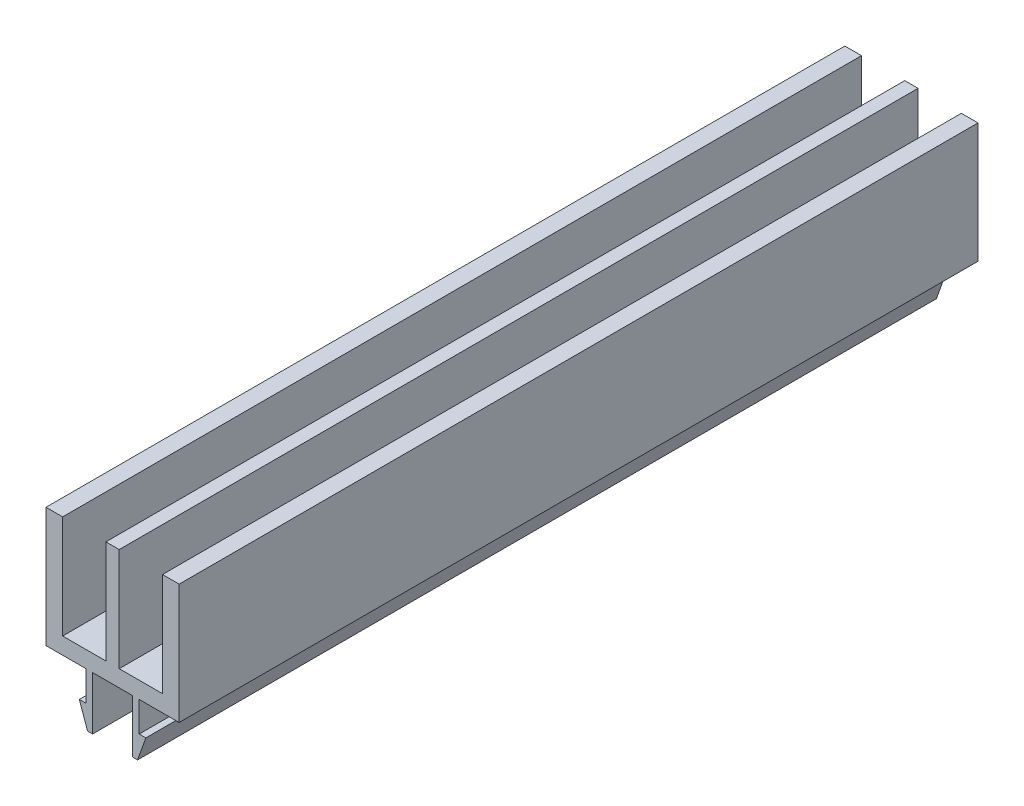
ISO-10303-21;
HEADER;
FILE_DESCRIPTION(('STEP AP214'),'2;1');
FILE_NAME('part.step','',(''),(''),'','','');
FILE_SCHEMA(('AUTOMOTIVE_DESIGN { 1 0 10303 214 1 1 1 1 }'));
ENDSEC;
DATA;
#1=APPLICATION_CONTEXT('core data for automotive mechanical design processes');
#2=APPLICATION_PROTOCOL_DEFINITION('international standard','automotive_design',2000,#1);
#3=PRODUCT_CONTEXT('',#1,'mechanical');
#4=PRODUCT('Part','Part','',(#3));
#5=PRODUCT_RELATED_PRODUCT_CATEGORY('part','',(#4));
#6=PRODUCT_DEFINITION_FORMATION('','',#4);
#7=PRODUCT_DEFINITION_CONTEXT('part definition',#1,'design');
#8=PRODUCT_DEFINITION('design','',#6,#7);
#9=PRODUCT_DEFINITION_SHAPE('','',#8);
#10=(LENGTH_UNIT() NAMED_UNIT(*) SI_UNIT(.MILLI.,.METRE.));
#11=(NAMED_UNIT(*) PLANE_ANGLE_UNIT() SI_UNIT($,.RADIAN.));
#12=(NAMED_UNIT(*) SI_UNIT($,.STERADIAN.) SOLID_ANGLE_UNIT());
#13=UNCERTAINTY_MEASURE_WITH_UNIT(LENGTH_MEASURE(1.E-05),#10,'distance_accuracy_value','');
#14=(GEOMETRIC_REPRESENTATION_CONTEXT(3) GLOBAL_UNCERTAINTY_ASSIGNED_CONTEXT((#13)) GLOBAL_UNIT_ASSIGNED_CONTEXT((#10,
#11,#12)) REPRESENTATION_CONTEXT('',''));
#15=CARTESIAN_POINT('',(0.,0.,0.));
#16=DIRECTION('',(0.,0.,1.));
#17=DIRECTION('',(1.,0.,0.));
#18=AXIS2_PLACEMENT_3D('',#15,#16,#17);
#19=CARTESIAN_POINT('',(-1.,17.9999999975,-70.));
#20=DIRECTION('',(-1.,0.,0.));
#21=DIRECTION('',(0.,-1.,0.));
#22=AXIS2_PLACEMENT_3D('',#19,#20,#21);
#23=PLANE('',#22);
#24=DIRECTION('',(0.,-1.,0.));
#25=VECTOR('',#24,1.);
#26=CARTESIAN_POINT('',(-1.,17.9999999975,50.));
#27=LINE('',#26,#25);
#28=CARTESIAN_POINT('',(-1.,17.9999999975,50.));
#29=VERTEX_POINT('',#28);
#30=CARTESIAN_POINT('',(-1.,2.4999999995,50.));
#31=VERTEX_POINT('',#30);
#32=EDGE_CURVE('E228',#29,#31,#27,.T.);
#33=ORIENTED_EDGE('',*,*,#32,.F.);
#34=DIRECTION('',(0.,0.,1.));
#35=VECTOR('',#34,1.);
#36=CARTESIAN_POINT('',(-1.,17.9999999975,-70.));
#37=LINE('',#36,#35);
#38=CARTESIAN_POINT('',(-1.,17.9999999975,-70.));
#39=VERTEX_POINT('',#38);
#40=EDGE_CURVE('E11',#39,#29,#37,.T.);
#41=ORIENTED_EDGE('',*,*,#40,.F.);
#42=DIRECTION('',(0.,-1.,0.));
#43=VECTOR('',#42,1.);
#44=CARTESIAN_POINT('',(-1.,17.9999999975,-70.));
#45=LINE('',#44,#43);
#46=CARTESIAN_POINT('',(-1.,2.4999999995,-70.));
#47=VERTEX_POINT('',#46);
#48=EDGE_CURVE('E296',#39,#47,#45,.T.);
#49=ORIENTED_EDGE('',*,*,#48,.T.);
#50=DIRECTION('',(0.,0.,1.));
#51=VECTOR('',#50,1.);
#52=CARTESIAN_POINT('',(-1.,2.4999999995,-70.));
#53=LINE('',#52,#51);
#54=EDGE_CURVE('E38',#47,#31,#53,.T.);
#55=ORIENTED_EDGE('',*,*,#54,.T.);
#56=EDGE_LOOP('',(#33,#41,#49,#55));
#57=FACE_BOUND('',#56,.T.);
#58=ADVANCED_FACE('F35',(#57),#23,.T.);
#59=CARTESIAN_POINT('',(0.999999999999998,17.9999999975,-70.));
#60=DIRECTION('',(0.,1.,0.));
#61=DIRECTION('',(0.,0.,1.));
#62=AXIS2_PLACEMENT_3D('',#59,#60,#61);
#63=PLANE('',#62);
#64=DIRECTION('',(-1.,0.,0.));
#65=VECTOR('',#64,1.);
#66=CARTESIAN_POINT('',(0.999999999999998,17.9999999975,50.));
#67=LINE('',#66,#65);
#68=CARTESIAN_POINT('',(0.999999999999998,17.9999999975,50.));
#69=VERTEX_POINT('',#68);
#70=EDGE_CURVE('E294',#69,#29,#67,.T.);
#71=ORIENTED_EDGE('',*,*,#70,.F.);
#72=DIRECTION('',(0.,0.,1.));
#73=VECTOR('',#72,1.);
#74=CARTESIAN_POINT('',(0.999999999999998,17.9999999975,-70.));
#75=LINE('',#74,#73);
#76=CARTESIAN_POINT('',(0.999999999999998,17.9999999975,-70.));
#77=VERTEX_POINT('',#76);
#78=EDGE_CURVE('E44',#77,#69,#75,.T.);
#79=ORIENTED_EDGE('',*,*,#78,.F.);
#80=DIRECTION('',(-1.,0.,0.));
#81=VECTOR('',#80,1.);
#82=CARTESIAN_POINT('',(0.999999999999998,17.9999999975,-70.));
#83=LINE('',#82,#81);
#84=EDGE_CURVE('E218',#77,#39,#83,.T.);
#85=ORIENTED_EDGE('',*,*,#84,.T.);
#86=ORIENTED_EDGE('',*,*,#40,.T.);
#87=EDGE_LOOP('',(#71,#79,#85,#86));
#88=FACE_BOUND('',#87,.T.);
#89=ADVANCED_FACE('F340',(#88),#63,.T.);
#90=CARTESIAN_POINT('',(0.999999999999998,2.4999999995,-70.));
#91=DIRECTION('',(1.,0.,0.));
#92=DIRECTION('',(0.,0.,-1.));
#93=AXIS2_PLACEMENT_3D('',#90,#91,#92);
#94=PLANE('',#93);
#95=DIRECTION('',(0.,1.,0.));
#96=VECTOR('',#95,1.);
#97=CARTESIAN_POINT('',(0.999999999999998,2.4999999995,50.));
#98=LINE('',#97,#96);
#99=CARTESIAN_POINT('',(0.999999999999998,2.4999999995,50.));
#100=VERTEX_POINT('',#99);
#101=EDGE_CURVE('E205',#100,#69,#98,.T.);
#102=ORIENTED_EDGE('',*,*,#101,.F.);
#103=DIRECTION('',(0.,0.,1.));
#104=VECTOR('',#103,1.);
#105=CARTESIAN_POINT('',(0.999999999999998,2.4999999995,-70.));
#106=LINE('',#105,#104);
#107=CARTESIAN_POINT('',(0.999999999999998,2.4999999995,-70.));
#108=VERTEX_POINT('',#107);
#109=EDGE_CURVE('E200',#108,#100,#106,.T.);
#110=ORIENTED_EDGE('',*,*,#109,.F.);
#111=DIRECTION('',(0.,1.,0.));
#112=VECTOR('',#111,1.);
#113=CARTESIAN_POINT('',(0.999999999999998,2.4999999995,-70.));
#114=LINE('',#113,#112);
#115=EDGE_CURVE('E203',#108,#77,#114,.T.);
#116=ORIENTED_EDGE('',*,*,#115,.T.);
#117=ORIENTED_EDGE('',*,*,#78,.T.);
#118=EDGE_LOOP('',(#102,#110,#116,#117));
#119=FACE_BOUND('',#118,.T.);
#120=ADVANCED_FACE('F202',(#119),#94,.T.);
#121=CARTESIAN_POINT('',(7.5,2.4999999995,-70.));
#122=DIRECTION('',(0.,1.,0.));
#123=DIRECTION('',(-1.,0.,0.));
#124=AXIS2_PLACEMENT_3D('',#121,#122,#123);
#125=PLANE('',#124);
#126=DIRECTION('',(-1.,0.,0.));
#127=VECTOR('',#126,1.);
#128=CARTESIAN_POINT('',(7.5,2.4999999995,50.));
#129=LINE('',#128,#127);
#130=CARTESIAN_POINT('',(7.5,2.4999999995,50.));
#131=VERTEX_POINT('',#130);
#132=EDGE_CURVE('E291',#131,#100,#129,.T.);
#133=ORIENTED_EDGE('',*,*,#132,.F.);
#134=DIRECTION('',(0.,0.,1.));
#135=VECTOR('',#134,1.);
#136=CARTESIAN_POINT('',(7.5,2.4999999995,-70.));
#137=LINE('',#136,#135);
#138=CARTESIAN_POINT('',(7.5,2.4999999995,-70.));
#139=VERTEX_POINT('',#138);
#140=EDGE_CURVE('E210',#139,#131,#137,.T.);
#141=ORIENTED_EDGE('',*,*,#140,.F.);
#142=DIRECTION('',(-1.,0.,0.));
#143=VECTOR('',#142,1.);
#144=CARTESIAN_POINT('',(7.5,2.4999999995,-70.));
#145=LINE('',#144,#143);
#146=EDGE_CURVE('E216',#139,#108,#145,.T.);
#147=ORIENTED_EDGE('',*,*,#146,.T.);
#148=ORIENTED_EDGE('',*,*,#109,.T.);
#149=EDGE_LOOP('',(#133,#141,#147,#148));
#150=FACE_BOUND('',#149,.T.);
#151=ADVANCED_FACE('F220',(#150),#125,.T.);
#152=CARTESIAN_POINT('',(7.5,17.9999999975,-70.));
#153=DIRECTION('',(-1.,0.,0.));
#154=DIRECTION('',(0.,-1.,0.));
#155=AXIS2_PLACEMENT_3D('',#152,#153,#154);
#156=PLANE('',#155);
#157=DIRECTION('',(0.,-1.,0.));
#158=VECTOR('',#157,1.);
#159=CARTESIAN_POINT('',(7.5,17.9999999975,50.));
#160=LINE('',#159,#158);
#161=CARTESIAN_POINT('',(7.5,17.9999999975,50.));
#162=VERTEX_POINT('',#161);
#163=EDGE_CURVE('E288',#162,#131,#160,.T.);
#164=ORIENTED_EDGE('',*,*,#163,.F.);
#165=DIRECTION('',(0.,0.,1.));
#166=VECTOR('',#165,1.);
#167=CARTESIAN_POINT('',(7.5,17.9999999975,-70.));
#168=LINE('',#167,#166);
#169=CARTESIAN_POINT('',(7.5,17.9999999975,-70.));
#170=VERTEX_POINT('',#169);
#171=EDGE_CURVE('E300',#170,#162,#168,.T.);
#172=ORIENTED_EDGE('',*,*,#171,.F.);
#173=DIRECTION('',(0.,-1.,0.));
#174=VECTOR('',#173,1.);
#175=CARTESIAN_POINT('',(7.5,17.9999999975,-70.));
#176=LINE('',#175,#174);
#177=EDGE_CURVE('E221',#170,#139,#176,.T.);
#178=ORIENTED_EDGE('',*,*,#177,.T.);
#179=ORIENTED_EDGE('',*,*,#140,.T.);
#180=EDGE_LOOP('',(#164,#172,#178,#179));
#181=FACE_BOUND('',#180,.T.);
#182=ADVANCED_FACE('F353',(#181),#156,.T.);
#183=CARTESIAN_POINT('',(10.,17.9999999975,-70.));
#184=DIRECTION('',(0.,1.,0.));
#185=DIRECTION('',(0.,0.,1.));
#186=AXIS2_PLACEMENT_3D('',#183,#184,#185);
#187=PLANE('',#186);
#188=DIRECTION('',(-1.,0.,0.));
#189=VECTOR('',#188,1.);
#190=CARTESIAN_POINT('',(10.,17.9999999975,50.));
#191=LINE('',#190,#189);
#192=CARTESIAN_POINT('',(10.,17.9999999975,50.));
#193=VERTEX_POINT('',#192);
#194=EDGE_CURVE('E285',#193,#162,#191,.T.);
#195=ORIENTED_EDGE('',*,*,#194,.F.);
#196=DIRECTION('',(0.,0.,1.));
#197=VECTOR('',#196,1.);
#198=CARTESIAN_POINT('',(10.,17.9999999975,-70.));
#199=LINE('',#198,#197);
#200=CARTESIAN_POINT('',(10.,17.9999999975,-70.));
#201=VERTEX_POINT('',#200);
#202=EDGE_CURVE('E302',#201,#193,#199,.T.);
#203=ORIENTED_EDGE('',*,*,#202,.F.);
#204=DIRECTION('',(-1.,0.,0.));
#205=VECTOR('',#204,1.);
#206=CARTESIAN_POINT('',(10.,17.9999999975,-70.));
#207=LINE('',#206,#205);
#208=EDGE_CURVE('E223',#201,#170,#207,.T.);
#209=ORIENTED_EDGE('',*,*,#208,.T.);
#210=ORIENTED_EDGE('',*,*,#171,.T.);
#211=EDGE_LOOP('',(#195,#203,#209,#210));
#212=FACE_BOUND('',#211,.T.);
#213=ADVANCED_FACE('F356',(#212),#187,.T.);
#214=CARTESIAN_POINT('',(10.,-4.99999828349541E-10,-70.));
#215=DIRECTION('',(1.,0.,0.));
#216=DIRECTION('',(0.,0.,-1.));
#217=AXIS2_PLACEMENT_3D('',#214,#215,#216);
#218=PLANE('',#217);
#219=DIRECTION('',(0.,1.,0.));
#220=VECTOR('',#219,1.);
#221=CARTESIAN_POINT('',(10.,-4.99999828349541E-10,50.));
#222=LINE('',#221,#220);
#223=CARTESIAN_POINT('',(10.,-4.99999828349541E-10,50.));
#224=VERTEX_POINT('',#223);
#225=EDGE_CURVE('E282',#224,#193,#222,.T.);
#226=ORIENTED_EDGE('',*,*,#225,.F.);
#227=DIRECTION('',(0.,0.,1.));
#228=VECTOR('',#227,1.);
#229=CARTESIAN_POINT('',(10.,-4.99999828349541E-10,-70.));
#230=LINE('',#229,#228);
#231=CARTESIAN_POINT('',(10.,-4.99999828349541E-10,-70.));
#232=VERTEX_POINT('',#231);
#233=EDGE_CURVE('E304',#232,#224,#230,.T.);
#234=ORIENTED_EDGE('',*,*,#233,.F.);
#235=DIRECTION('',(0.,1.,0.));
#236=VECTOR('',#235,1.);
#237=CARTESIAN_POINT('',(10.,-4.99999828349541E-10,-70.));
#238=LINE('',#237,#236);
#239=EDGE_CURVE('E646',#232,#201,#238,.T.);
#240=ORIENTED_EDGE('',*,*,#239,.T.);
#241=ORIENTED_EDGE('',*,*,#202,.T.);
#242=EDGE_LOOP('',(#226,#234,#240,#241));
#243=FACE_BOUND('',#242,.T.);
#244=ADVANCED_FACE('F360',(#243),#218,.T.);
#245=CARTESIAN_POINT('',(4.,-4.99999998002099E-10,-70.));
#246=DIRECTION('',(0.,-1.,0.));
#247=DIRECTION('',(1.,0.,0.));
#248=AXIS2_PLACEMENT_3D('',#245,#246,#247);
#249=PLANE('',#248);
#250=DIRECTION('',(1.,0.,0.));
#251=VECTOR('',#250,1.);
#252=CARTESIAN_POINT('',(4.,-4.99999998002099E-10,50.));
#253=LINE('',#252,#251);
#254=CARTESIAN_POINT('',(4.,-4.99999998002099E-10,50.));
#255=VERTEX_POINT('',#254);
#256=EDGE_CURVE('E279',#255,#224,#253,.T.);
#257=ORIENTED_EDGE('',*,*,#256,.F.);
#258=DIRECTION('',(0.,0.,1.));
#259=VECTOR('',#258,1.);
#260=CARTESIAN_POINT('',(4.,-4.99999998002099E-10,-70.));
#261=LINE('',#260,#259);
#262=CARTESIAN_POINT('',(4.,-4.99999998002099E-10,-70.));
#263=VERTEX_POINT('',#262);
#264=EDGE_CURVE('E306',#263,#255,#261,.T.);
#265=ORIENTED_EDGE('',*,*,#264,.F.);
#266=DIRECTION('',(1.,0.,0.));
#267=VECTOR('',#266,1.);
#268=CARTESIAN_POINT('',(4.,-4.99999998002099E-10,-70.));
#269=LINE('',#268,#267);
#270=EDGE_CURVE('E650',#263,#232,#269,.T.);
#271=ORIENTED_EDGE('',*,*,#270,.T.);
#272=ORIENTED_EDGE('',*,*,#233,.T.);
#273=EDGE_LOOP('',(#257,#265,#271,#272));
#274=FACE_BOUND('',#273,.T.);
#275=ADVANCED_FACE('F364',(#274),#249,.T.);
#276=CARTESIAN_POINT('',(4.,-4.5,-70.));
#277=DIRECTION('',(1.,0.,0.));
#278=DIRECTION('',(0.,0.,-1.));
#279=AXIS2_PLACEMENT_3D('',#276,#277,#278);
#280=PLANE('',#279);
#281=DIRECTION('',(0.,1.,0.));
#282=VECTOR('',#281,1.);
#283=CARTESIAN_POINT('',(4.,-4.5,50.));
#284=LINE('',#283,#282);
#285=CARTESIAN_POINT('',(4.,-4.5,50.));
#286=VERTEX_POINT('',#285);
#287=EDGE_CURVE('E276',#286,#255,#284,.T.);
#288=ORIENTED_EDGE('',*,*,#287,.F.);
#289=DIRECTION('',(0.,0.,1.));
#290=VECTOR('',#289,1.);
#291=CARTESIAN_POINT('',(4.,-4.5,-70.));
#292=LINE('',#291,#290);
#293=CARTESIAN_POINT('',(4.,-4.5,-70.));
#294=VERTEX_POINT('',#293);
#295=EDGE_CURVE('E308',#294,#286,#292,.T.);
#296=ORIENTED_EDGE('',*,*,#295,.F.);
#297=DIRECTION('',(0.,1.,0.));
#298=VECTOR('',#297,1.);
#299=CARTESIAN_POINT('',(4.,-4.5,-70.));
#300=LINE('',#299,#298);
#301=EDGE_CURVE('E639',#294,#263,#300,.T.);
#302=ORIENTED_EDGE('',*,*,#301,.T.);
#303=ORIENTED_EDGE('',*,*,#264,.T.);
#304=EDGE_LOOP('',(#288,#296,#302,#303));
#305=FACE_BOUND('',#304,.T.);
#306=ADVANCED_FACE('F368',(#305),#280,.T.);
#307=CARTESIAN_POINT('',(5.,-4.5,-70.));
#308=DIRECTION('',(0.,1.,0.));
#309=DIRECTION('',(0.,0.,1.));
#310=AXIS2_PLACEMENT_3D('',#307,#308,#309);
#311=PLANE('',#310);
#312=DIRECTION('',(-1.,0.,0.));
#313=VECTOR('',#312,1.);
#314=CARTESIAN_POINT('',(5.,-4.5,50.));
#315=LINE('',#314,#313);
#316=CARTESIAN_POINT('',(5.,-4.5,50.));
#317=VERTEX_POINT('',#316);
#318=EDGE_CURVE('E273',#317,#286,#315,.T.);
#319=ORIENTED_EDGE('',*,*,#318,.F.);
#320=DIRECTION('',(0.,0.,1.));
#321=VECTOR('',#320,1.);
#322=CARTESIAN_POINT('',(5.,-4.5,-70.));
#323=LINE('',#322,#321);
#324=CARTESIAN_POINT('',(5.,-4.5,-70.));
#325=VERTEX_POINT('',#324);
#326=EDGE_CURVE('E310',#325,#317,#323,.T.);
#327=ORIENTED_EDGE('',*,*,#326,.F.);
#328=DIRECTION('',(-1.,0.,0.));
#329=VECTOR('',#328,1.);
#330=CARTESIAN_POINT('',(5.,-4.5,-70.));
#331=LINE('',#330,#329);
#332=EDGE_CURVE('E635',#325,#294,#331,.T.);
#333=ORIENTED_EDGE('',*,*,#332,.T.);
#334=ORIENTED_EDGE('',*,*,#295,.T.);
#335=EDGE_LOOP('',(#319,#327,#333,#334));
#336=FACE_BOUND('',#335,.T.);
#337=ADVANCED_FACE('F372',(#336),#311,.T.);
#338=CARTESIAN_POINT('',(3.75,-8.,-70.));
#339=DIRECTION('',(0.941741911594837,-0.336336396998156,0.));
#340=DIRECTION('',(0.336336396998157,0.941741911594838,0.));
#341=AXIS2_PLACEMENT_3D('',#338,#339,#340);
#342=PLANE('',#341);
#343=DIRECTION('',(0.336336396998157,0.941741911594837,0.));
#344=VECTOR('',#343,1.);
#345=CARTESIAN_POINT('',(3.75,-8.,50.));
#346=LINE('',#345,#344);
#347=CARTESIAN_POINT('',(3.75,-8.,50.));
#348=VERTEX_POINT('',#347);
#349=EDGE_CURVE('E270',#348,#317,#346,.T.);
#350=ORIENTED_EDGE('',*,*,#349,.F.);
#351=DIRECTION('',(0.,0.,1.));
#352=VECTOR('',#351,1.);
#353=CARTESIAN_POINT('',(3.75,-8.,-70.));
#354=LINE('',#353,#352);
#355=CARTESIAN_POINT('',(3.75,-8.,-70.));
#356=VERTEX_POINT('',#355);
#357=EDGE_CURVE('E312',#356,#348,#354,.T.);
#358=ORIENTED_EDGE('',*,*,#357,.F.);
#359=DIRECTION('',(0.336336396998157,0.941741911594837,0.));
#360=VECTOR('',#359,1.);
#361=CARTESIAN_POINT('',(3.75,-8.,-70.));
#362=LINE('',#361,#360);
#363=EDGE_CURVE('E656',#356,#325,#362,.T.);
#364=ORIENTED_EDGE('',*,*,#363,.T.);
#365=ORIENTED_EDGE('',*,*,#326,.T.);
#366=EDGE_LOOP('',(#350,#358,#364,#365));
#367=FACE_BOUND('',#366,.T.);
#368=ADVANCED_FACE('F376',(#367),#342,.T.);
#369=CARTESIAN_POINT('',(3.,-8.,-70.));
#370=DIRECTION('',(0.,-1.,0.));
#371=DIRECTION('',(0.,0.,-1.));
#372=AXIS2_PLACEMENT_3D('',#369,#370,#371);
#373=PLANE('',#372);
#374=DIRECTION('',(1.,0.,0.));
#375=VECTOR('',#374,1.);
#376=CARTESIAN_POINT('',(3.,-8.,50.));
#377=LINE('',#376,#375);
#378=CARTESIAN_POINT('',(3.,-8.,50.));
#379=VERTEX_POINT('',#378);
#380=EDGE_CURVE('E267',#379,#348,#377,.T.);
#381=ORIENTED_EDGE('',*,*,#380,.F.);
#382=DIRECTION('',(0.,0.,1.));
#383=VECTOR('',#382,1.);
#384=CARTESIAN_POINT('',(3.,-8.,-70.));
#385=LINE('',#384,#383);
#386=CARTESIAN_POINT('',(3.,-8.,-70.));
#387=VERTEX_POINT('',#386);
#388=EDGE_CURVE('E314',#387,#379,#385,.T.);
#389=ORIENTED_EDGE('',*,*,#388,.F.);
#390=DIRECTION('',(1.,0.,0.));
#391=VECTOR('',#390,1.);
#392=CARTESIAN_POINT('',(3.,-8.,-70.));
#393=LINE('',#392,#391);
#394=EDGE_CURVE('E628',#387,#356,#393,.T.);
#395=ORIENTED_EDGE('',*,*,#394,.T.);
#396=ORIENTED_EDGE('',*,*,#357,.T.);
#397=EDGE_LOOP('',(#381,#389,#395,#396));
#398=FACE_BOUND('',#397,.T.);
#399=ADVANCED_FACE('F380',(#398),#373,.T.);
#400=CARTESIAN_POINT('',(3.,-4.9999985194348E-10,-70.));
#401=DIRECTION('',(-1.,0.,0.));
#402=DIRECTION('',(0.,0.,1.));
#403=AXIS2_PLACEMENT_3D('',#400,#401,#402);
#404=PLANE('',#403);
#405=DIRECTION('',(0.,-1.,0.));
#406=VECTOR('',#405,1.);
#407=CARTESIAN_POINT('',(3.,-4.9999985194348E-10,50.));
#408=LINE('',#407,#406);
#409=CARTESIAN_POINT('',(3.,-4.9999985194348E-10,50.));
#410=VERTEX_POINT('',#409);
#411=EDGE_CURVE('E264',#410,#379,#408,.T.);
#412=ORIENTED_EDGE('',*,*,#411,.F.);
#413=DIRECTION('',(0.,0.,1.));
#414=VECTOR('',#413,1.);
#415=CARTESIAN_POINT('',(3.,-4.9999985194348E-10,-70.));
#416=LINE('',#415,#414);
#417=CARTESIAN_POINT('',(3.,-4.9999985194348E-10,-70.));
#418=VERTEX_POINT('',#417);
#419=EDGE_CURVE('E316',#418,#410,#416,.T.);
#420=ORIENTED_EDGE('',*,*,#419,.F.);
#421=DIRECTION('',(0.,-1.,0.));
#422=VECTOR('',#421,1.);
#423=CARTESIAN_POINT('',(3.,-4.9999985194348E-10,-70.));
#424=LINE('',#423,#422);
#425=EDGE_CURVE('E624',#418,#387,#424,.T.);
#426=ORIENTED_EDGE('',*,*,#425,.T.);
#427=ORIENTED_EDGE('',*,*,#388,.T.);
#428=EDGE_LOOP('',(#412,#420,#426,#427));
#429=FACE_BOUND('',#428,.T.);
#430=ADVANCED_FACE('F384',(#429),#404,.T.);
#431=CARTESIAN_POINT('',(-3.,-4.99999455901012E-10,-70.));
#432=DIRECTION('',(0.,-1.,0.));
#433=DIRECTION('',(1.,0.,0.));
#434=AXIS2_PLACEMENT_3D('',#431,#432,#433);
#435=PLANE('',#434);
#436=DIRECTION('',(1.,0.,0.));
#437=VECTOR('',#436,1.);
#438=CARTESIAN_POINT('',(-3.,-4.99999455901012E-10,50.));
#439=LINE('',#438,#437);
#440=CARTESIAN_POINT('',(-3.,-4.99999455901012E-10,50.));
#441=VERTEX_POINT('',#440);
#442=EDGE_CURVE('E261',#441,#410,#439,.T.);
#443=ORIENTED_EDGE('',*,*,#442,.F.);
#444=DIRECTION('',(0.,0.,1.));
#445=VECTOR('',#444,1.);
#446=CARTESIAN_POINT('',(-3.,-4.99999455901012E-10,-70.));
#447=LINE('',#446,#445);
#448=CARTESIAN_POINT('',(-3.,-4.99999455901012E-10,-70.));
#449=VERTEX_POINT('',#448);
#450=EDGE_CURVE('E318',#449,#441,#447,.T.);
#451=ORIENTED_EDGE('',*,*,#450,.F.);
#452=DIRECTION('',(1.,0.,0.));
#453=VECTOR('',#452,1.);
#454=CARTESIAN_POINT('',(-3.,-4.99999455901012E-10,-70.));
#455=LINE('',#454,#453);
#456=EDGE_CURVE('E660',#449,#418,#455,.T.);
#457=ORIENTED_EDGE('',*,*,#456,.T.);
#458=ORIENTED_EDGE('',*,*,#419,.T.);
#459=EDGE_LOOP('',(#443,#451,#457,#458));
#460=FACE_BOUND('',#459,.T.);
#461=ADVANCED_FACE('F388',(#460),#435,.T.);
#462=CARTESIAN_POINT('',(-3.,-8.,-70.));
#463=DIRECTION('',(1.,0.,0.));
#464=DIRECTION('',(0.,0.,-1.));
#465=AXIS2_PLACEMENT_3D('',#462,#463,#464);
#466=PLANE('',#465);
#467=DIRECTION('',(0.,1.,0.));
#468=VECTOR('',#467,1.);
#469=CARTESIAN_POINT('',(-3.,-8.,50.));
#470=LINE('',#469,#468);
#471=CARTESIAN_POINT('',(-3.,-8.,50.));
#472=VERTEX_POINT('',#471);
#473=EDGE_CURVE('E258',#472,#441,#470,.T.);
#474=ORIENTED_EDGE('',*,*,#473,.F.);
#475=DIRECTION('',(0.,0.,1.));
#476=VECTOR('',#475,1.);
#477=CARTESIAN_POINT('',(-3.,-8.,-70.));
#478=LINE('',#477,#476);
#479=CARTESIAN_POINT('',(-3.,-8.,-70.));
#480=VERTEX_POINT('',#479);
#481=EDGE_CURVE('E320',#480,#472,#478,.T.);
#482=ORIENTED_EDGE('',*,*,#481,.F.);
#483=DIRECTION('',(0.,1.,0.));
#484=VECTOR('',#483,1.);
#485=CARTESIAN_POINT('',(-3.,-8.,-70.));
#486=LINE('',#485,#484);
#487=EDGE_CURVE('E617',#480,#449,#486,.T.);
#488=ORIENTED_EDGE('',*,*,#487,.T.);
#489=ORIENTED_EDGE('',*,*,#450,.T.);
#490=EDGE_LOOP('',(#474,#482,#488,#489));
#491=FACE_BOUND('',#490,.T.);
#492=ADVANCED_FACE('F392',(#491),#466,.T.);
#493=CARTESIAN_POINT('',(-3.75,-8.,-70.));
#494=DIRECTION('',(0.,-1.,0.));
#495=DIRECTION('',(0.,0.,-1.));
#496=AXIS2_PLACEMENT_3D('',#493,#494,#495);
#497=PLANE('',#496);
#498=DIRECTION('',(1.,0.,0.));
#499=VECTOR('',#498,1.);
#500=CARTESIAN_POINT('',(-3.75,-8.,50.));
#501=LINE('',#500,#499);
#502=CARTESIAN_POINT('',(-3.75,-8.,50.));
#503=VERTEX_POINT('',#502);
#504=EDGE_CURVE('E255',#503,#472,#501,.T.);
#505=ORIENTED_EDGE('',*,*,#504,.F.);
#506=DIRECTION('',(0.,0.,1.));
#507=VECTOR('',#506,1.);
#508=CARTESIAN_POINT('',(-3.75,-8.,-70.));
#509=LINE('',#508,#507);
#510=CARTESIAN_POINT('',(-3.75,-8.,-70.));
#511=VERTEX_POINT('',#510);
#512=EDGE_CURVE('E322',#511,#503,#509,.T.);
#513=ORIENTED_EDGE('',*,*,#512,.F.);
#514=DIRECTION('',(1.,0.,0.));
#515=VECTOR('',#514,1.);
#516=CARTESIAN_POINT('',(-3.75,-8.,-70.));
#517=LINE('',#516,#515);
#518=EDGE_CURVE('E613',#511,#480,#517,.T.);
#519=ORIENTED_EDGE('',*,*,#518,.T.);
#520=ORIENTED_EDGE('',*,*,#481,.T.);
#521=EDGE_LOOP('',(#505,#513,#519,#520));
#522=FACE_BOUND('',#521,.T.);
#523=ADVANCED_FACE('F396',(#522),#497,.T.);
#524=CARTESIAN_POINT('',(-5.,-4.5,-70.));
#525=DIRECTION('',(-0.941741911594837,-0.336336396998156,0.));
#526=DIRECTION('',(0.336336396998156,-0.941741911594837,0.));
#527=AXIS2_PLACEMENT_3D('',#524,#525,#526);
#528=PLANE('',#527);
#529=DIRECTION('',(0.336336396998156,-0.941741911594837,0.));
#530=VECTOR('',#529,1.);
#531=CARTESIAN_POINT('',(-5.,-4.5,50.));
#532=LINE('',#531,#530);
#533=CARTESIAN_POINT('',(-5.,-4.5,50.));
#534=VERTEX_POINT('',#533);
#535=EDGE_CURVE('E252',#534,#503,#532,.T.);
#536=ORIENTED_EDGE('',*,*,#535,.F.);
#537=DIRECTION('',(0.,0.,1.));
#538=VECTOR('',#537,1.);
#539=CARTESIAN_POINT('',(-5.,-4.5,-70.));
#540=LINE('',#539,#538);
#541=CARTESIAN_POINT('',(-5.,-4.5,-70.));
#542=VERTEX_POINT('',#541);
#543=EDGE_CURVE('E324',#542,#534,#540,.T.);
#544=ORIENTED_EDGE('',*,*,#543,.F.);
#545=DIRECTION('',(0.336336396998156,-0.941741911594837,0.));
#546=VECTOR('',#545,1.);
#547=CARTESIAN_POINT('',(-5.,-4.5,-70.));
#548=LINE('',#547,#546);
#549=EDGE_CURVE('E664',#542,#511,#548,.T.);
#550=ORIENTED_EDGE('',*,*,#549,.T.);
#551=ORIENTED_EDGE('',*,*,#512,.T.);
#552=EDGE_LOOP('',(#536,#544,#550,#551));
#553=FACE_BOUND('',#552,.T.);
#554=ADVANCED_FACE('F400',(#553),#528,.T.);
#555=CARTESIAN_POINT('',(-4.,-4.5,-70.));
#556=DIRECTION('',(0.,1.,0.));
#557=DIRECTION('',(0.,0.,1.));
#558=AXIS2_PLACEMENT_3D('',#555,#556,#557);
#559=PLANE('',#558);
#560=DIRECTION('',(-1.,0.,0.));
#561=VECTOR('',#560,1.);
#562=CARTESIAN_POINT('',(-4.,-4.5,50.));
#563=LINE('',#562,#561);
#564=CARTESIAN_POINT('',(-4.,-4.5,50.));
#565=VERTEX_POINT('',#564);
#566=EDGE_CURVE('E249',#565,#534,#563,.T.);
#567=ORIENTED_EDGE('',*,*,#566,.F.);
#568=DIRECTION('',(0.,0.,1.));
#569=VECTOR('',#568,1.);
#570=CARTESIAN_POINT('',(-4.,-4.5,-70.));
#571=LINE('',#570,#569);
#572=CARTESIAN_POINT('',(-4.,-4.5,-70.));
#573=VERTEX_POINT('',#572);
#574=EDGE_CURVE('E326',#573,#565,#571,.T.);
#575=ORIENTED_EDGE('',*,*,#574,.F.);
#576=DIRECTION('',(-1.,0.,0.));
#577=VECTOR('',#576,1.);
#578=CARTESIAN_POINT('',(-4.,-4.5,-70.));
#579=LINE('',#578,#577);
#580=EDGE_CURVE('E606',#573,#542,#579,.T.);
#581=ORIENTED_EDGE('',*,*,#580,.T.);
#582=ORIENTED_EDGE('',*,*,#543,.T.);
#583=EDGE_LOOP('',(#567,#575,#581,#582));
#584=FACE_BOUND('',#583,.T.);
#585=ADVANCED_FACE('F404',(#584),#559,.T.);
#586=CARTESIAN_POINT('',(-4.,-4.9999985194348E-10,-70.));
#587=DIRECTION('',(-1.,0.,0.));
#588=DIRECTION('',(0.,0.,1.));
#589=AXIS2_PLACEMENT_3D('',#586,#587,#588);
#590=PLANE('',#589);
#591=DIRECTION('',(0.,-1.,0.));
#592=VECTOR('',#591,1.);
#593=CARTESIAN_POINT('',(-4.,-4.9999985194348E-10,50.));
#594=LINE('',#593,#592);
#595=CARTESIAN_POINT('',(-4.,-4.9999985194348E-10,50.));
#596=VERTEX_POINT('',#595);
#597=EDGE_CURVE('E246',#596,#565,#594,.T.);
#598=ORIENTED_EDGE('',*,*,#597,.F.);
#599=DIRECTION('',(0.,0.,1.));
#600=VECTOR('',#599,1.);
#601=CARTESIAN_POINT('',(-4.,-4.9999985194348E-10,-70.));
#602=LINE('',#601,#600);
#603=CARTESIAN_POINT('',(-4.,-4.9999985194348E-10,-70.));
#604=VERTEX_POINT('',#603);
#605=EDGE_CURVE('E328',#604,#596,#602,.T.);
#606=ORIENTED_EDGE('',*,*,#605,.F.);
#607=DIRECTION('',(0.,-1.,0.));
#608=VECTOR('',#607,1.);
#609=CARTESIAN_POINT('',(-4.,-4.9999985194348E-10,-70.));
#610=LINE('',#609,#608);
#611=EDGE_CURVE('E602',#604,#573,#610,.T.);
#612=ORIENTED_EDGE('',*,*,#611,.T.);
#613=ORIENTED_EDGE('',*,*,#574,.T.);
#614=EDGE_LOOP('',(#598,#606,#612,#613));
#615=FACE_BOUND('',#614,.T.);
#616=ADVANCED_FACE('F408',(#615),#590,.T.);
#617=CARTESIAN_POINT('',(-10.,-4.99999719929324E-10,-70.));
#618=DIRECTION('',(0.,-1.,0.));
#619=DIRECTION('',(1.,0.,0.));
#620=AXIS2_PLACEMENT_3D('',#617,#618,#619);
#621=PLANE('',#620);
#622=DIRECTION('',(1.,0.,0.));
#623=VECTOR('',#622,1.);
#624=CARTESIAN_POINT('',(-10.,-4.99999719929324E-10,50.));
#625=LINE('',#624,#623);
#626=CARTESIAN_POINT('',(-10.,-4.99999719929324E-10,50.));
#627=VERTEX_POINT('',#626);
#628=EDGE_CURVE('E243',#627,#596,#625,.T.);
#629=ORIENTED_EDGE('',*,*,#628,.F.);
#630=DIRECTION('',(0.,0.,1.));
#631=VECTOR('',#630,1.);
#632=CARTESIAN_POINT('',(-10.,-4.99999719929324E-10,-70.));
#633=LINE('',#632,#631);
#634=CARTESIAN_POINT('',(-10.,-4.99999719929324E-10,-70.));
#635=VERTEX_POINT('',#634);
#636=EDGE_CURVE('E330',#635,#627,#633,.T.);
#637=ORIENTED_EDGE('',*,*,#636,.F.);
#638=DIRECTION('',(1.,0.,0.));
#639=VECTOR('',#638,1.);
#640=CARTESIAN_POINT('',(-10.,-4.99999719929324E-10,-70.));
#641=LINE('',#640,#639);
#642=EDGE_CURVE('E668',#635,#604,#641,.T.);
#643=ORIENTED_EDGE('',*,*,#642,.T.);
#644=ORIENTED_EDGE('',*,*,#605,.T.);
#645=EDGE_LOOP('',(#629,#637,#643,#644));
#646=FACE_BOUND('',#645,.T.);
#647=ADVANCED_FACE('F412',(#646),#621,.T.);
#648=CARTESIAN_POINT('',(-10.,17.9999999975,-70.));
#649=DIRECTION('',(-1.,0.,0.));
#650=DIRECTION('',(0.,-1.,0.));
#651=AXIS2_PLACEMENT_3D('',#648,#649,#650);
#652=PLANE('',#651);
#653=DIRECTION('',(0.,-1.,0.));
#654=VECTOR('',#653,1.);
#655=CARTESIAN_POINT('',(-10.,17.9999999975,50.));
#656=LINE('',#655,#654);
#657=CARTESIAN_POINT('',(-10.,17.9999999975,50.));
#658=VERTEX_POINT('',#657);
#659=EDGE_CURVE('E240',#658,#627,#656,.T.);
#660=ORIENTED_EDGE('',*,*,#659,.F.);
#661=DIRECTION('',(0.,0.,1.));
#662=VECTOR('',#661,1.);
#663=CARTESIAN_POINT('',(-10.,17.9999999975,-70.));
#664=LINE('',#663,#662);
#665=CARTESIAN_POINT('',(-10.,17.9999999975,-70.));
#666=VERTEX_POINT('',#665);
#667=EDGE_CURVE('E332',#666,#658,#664,.T.);
#668=ORIENTED_EDGE('',*,*,#667,.F.);
#669=DIRECTION('',(0.,-1.,0.));
#670=VECTOR('',#669,1.);
#671=CARTESIAN_POINT('',(-10.,17.9999999975,-70.));
#672=LINE('',#671,#670);
#673=EDGE_CURVE('E595',#666,#635,#672,.T.);
#674=ORIENTED_EDGE('',*,*,#673,.T.);
#675=ORIENTED_EDGE('',*,*,#636,.T.);
#676=EDGE_LOOP('',(#660,#668,#674,#675));
#677=FACE_BOUND('',#676,.T.);
#678=ADVANCED_FACE('F416',(#677),#652,.T.);
#679=CARTESIAN_POINT('',(-7.5,17.9999999975,-70.));
#680=DIRECTION('',(0.,1.,0.));
#681=DIRECTION('',(0.,0.,1.));
#682=AXIS2_PLACEMENT_3D('',#679,#680,#681);
#683=PLANE('',#682);
#684=DIRECTION('',(-1.,0.,0.));
#685=VECTOR('',#684,1.);
#686=CARTESIAN_POINT('',(-7.5,17.9999999975,50.));
#687=LINE('',#686,#685);
#688=CARTESIAN_POINT('',(-7.5,17.9999999975,50.));
#689=VERTEX_POINT('',#688);
#690=EDGE_CURVE('E237',#689,#658,#687,.T.);
#691=ORIENTED_EDGE('',*,*,#690,.F.);
#692=DIRECTION('',(0.,0.,1.));
#693=VECTOR('',#692,1.);
#694=CARTESIAN_POINT('',(-7.5,17.9999999975,-70.));
#695=LINE('',#694,#693);
#696=CARTESIAN_POINT('',(-7.5,17.9999999975,-70.));
#697=VERTEX_POINT('',#696);
#698=EDGE_CURVE('E334',#697,#689,#695,.T.);
#699=ORIENTED_EDGE('',*,*,#698,.F.);
#700=DIRECTION('',(-1.,0.,0.));
#701=VECTOR('',#700,1.);
#702=CARTESIAN_POINT('',(-7.5,17.9999999975,-70.));
#703=LINE('',#702,#701);
#704=EDGE_CURVE('E591',#697,#666,#703,.T.);
#705=ORIENTED_EDGE('',*,*,#704,.T.);
#706=ORIENTED_EDGE('',*,*,#667,.T.);
#707=EDGE_LOOP('',(#691,#699,#705,#706));
#708=FACE_BOUND('',#707,.T.);
#709=ADVANCED_FACE('F420',(#708),#683,.T.);
#710=CARTESIAN_POINT('',(-7.5,2.4999999995,-70.));
#711=DIRECTION('',(1.,0.,0.));
#712=DIRECTION('',(0.,0.,-1.));
#713=AXIS2_PLACEMENT_3D('',#710,#711,#712);
#714=PLANE('',#713);
#715=DIRECTION('',(0.,1.,0.));
#716=VECTOR('',#715,1.);
#717=CARTESIAN_POINT('',(-7.5,2.4999999995,50.));
#718=LINE('',#717,#716);
#719=CARTESIAN_POINT('',(-7.5,2.4999999995,50.));
#720=VERTEX_POINT('',#719);
#721=EDGE_CURVE('E234',#720,#689,#718,.T.);
#722=ORIENTED_EDGE('',*,*,#721,.F.);
#723=DIRECTION('',(0.,0.,1.));
#724=VECTOR('',#723,1.);
#725=CARTESIAN_POINT('',(-7.5,2.4999999995,-70.));
#726=LINE('',#725,#724);
#727=CARTESIAN_POINT('',(-7.5,2.4999999995,-70.));
#728=VERTEX_POINT('',#727);
#729=EDGE_CURVE('E335',#728,#720,#726,.T.);
#730=ORIENTED_EDGE('',*,*,#729,.F.);
#731=DIRECTION('',(0.,1.,0.));
#732=VECTOR('',#731,1.);
#733=CARTESIAN_POINT('',(-7.5,2.4999999995,-70.));
#734=LINE('',#733,#732);
#735=EDGE_CURVE('E672',#728,#697,#734,.T.);
#736=ORIENTED_EDGE('',*,*,#735,.T.);
#737=ORIENTED_EDGE('',*,*,#698,.T.);
#738=EDGE_LOOP('',(#722,#730,#736,#737));
#739=FACE_BOUND('',#738,.T.);
#740=ADVANCED_FACE('F424',(#739),#714,.T.);
#741=CARTESIAN_POINT('',(-1.,2.4999999995,-70.));
#742=DIRECTION('',(0.,1.,0.));
#743=DIRECTION('',(-1.,0.,0.));
#744=AXIS2_PLACEMENT_3D('',#741,#742,#743);
#745=PLANE('',#744);
#746=DIRECTION('',(-1.,0.,0.));
#747=VECTOR('',#746,1.);
#748=CARTESIAN_POINT('',(-1.,2.4999999995,50.));
#749=LINE('',#748,#747);
#750=EDGE_CURVE('E231',#31,#720,#749,.T.);
#751=ORIENTED_EDGE('',*,*,#750,.F.);
#752=ORIENTED_EDGE('',*,*,#54,.F.);
#753=DIRECTION('',(-1.,0.,0.));
#754=VECTOR('',#753,1.);
#755=CARTESIAN_POINT('',(-1.,2.4999999995,-70.));
#756=LINE('',#755,#754);
#757=EDGE_CURVE('E674',#47,#728,#756,.T.);
#758=ORIENTED_EDGE('',*,*,#757,.T.);
#759=ORIENTED_EDGE('',*,*,#729,.T.);
#760=EDGE_LOOP('',(#751,#752,#758,#759));
#761=FACE_BOUND('',#760,.T.);
#762=ADVANCED_FACE('F337',(#761),#745,.T.);
#763=CARTESIAN_POINT('',(0.,0.,-70.));
#764=DIRECTION('',(0.,0.,-1.));
#765=DIRECTION('',(-1.,0.,0.));
#766=AXIS2_PLACEMENT_3D('',#763,#764,#765);
#767=PLANE('',#766);
#768=ORIENTED_EDGE('',*,*,#48,.F.);
#769=ORIENTED_EDGE('',*,*,#84,.F.);
#770=ORIENTED_EDGE('',*,*,#115,.F.);
#771=ORIENTED_EDGE('',*,*,#146,.F.);
#772=ORIENTED_EDGE('',*,*,#177,.F.);
#773=ORIENTED_EDGE('',*,*,#208,.F.);
#774=ORIENTED_EDGE('',*,*,#239,.F.);
#775=ORIENTED_EDGE('',*,*,#270,.F.);
#776=ORIENTED_EDGE('',*,*,#301,.F.);
#777=ORIENTED_EDGE('',*,*,#332,.F.);
#778=ORIENTED_EDGE('',*,*,#363,.F.);
#779=ORIENTED_EDGE('',*,*,#394,.F.);
#780=ORIENTED_EDGE('',*,*,#425,.F.);
#781=ORIENTED_EDGE('',*,*,#456,.F.);
#782=ORIENTED_EDGE('',*,*,#487,.F.);
#783=ORIENTED_EDGE('',*,*,#518,.F.);
#784=ORIENTED_EDGE('',*,*,#549,.F.);
#785=ORIENTED_EDGE('',*,*,#580,.F.);
#786=ORIENTED_EDGE('',*,*,#611,.F.);
#787=ORIENTED_EDGE('',*,*,#642,.F.);
#788=ORIENTED_EDGE('',*,*,#673,.F.);
#789=ORIENTED_EDGE('',*,*,#704,.F.);
#790=ORIENTED_EDGE('',*,*,#735,.F.);
#791=ORIENTED_EDGE('',*,*,#757,.F.);
#792=EDGE_LOOP('',(#768,#769,#770,#771,#772,#773,#774,#775,#776,#777,#778,#779,#780,#781,#782,
#783,#784,#785,#786,#787,#788,#789,#790,#791));
#793=FACE_BOUND('',#792,.T.);
#794=ADVANCED_FACE('F214',(#793),#767,.T.);
#795=CARTESIAN_POINT('',(0.,0.,50.));
#796=DIRECTION('',(0.,0.,-1.));
#797=DIRECTION('',(-1.,0.,0.));
#798=AXIS2_PLACEMENT_3D('',#795,#796,#797);
#799=PLANE('',#798);
#800=ORIENTED_EDGE('',*,*,#32,.T.);
#801=ORIENTED_EDGE('',*,*,#750,.T.);
#802=ORIENTED_EDGE('',*,*,#721,.T.);
#803=ORIENTED_EDGE('',*,*,#690,.T.);
#804=ORIENTED_EDGE('',*,*,#659,.T.);
#805=ORIENTED_EDGE('',*,*,#628,.T.);
#806=ORIENTED_EDGE('',*,*,#597,.T.);
#807=ORIENTED_EDGE('',*,*,#566,.T.);
#808=ORIENTED_EDGE('',*,*,#535,.T.);
#809=ORIENTED_EDGE('',*,*,#504,.T.);
#810=ORIENTED_EDGE('',*,*,#473,.T.);
#811=ORIENTED_EDGE('',*,*,#442,.T.);
#812=ORIENTED_EDGE('',*,*,#411,.T.);
#813=ORIENTED_EDGE('',*,*,#380,.T.);
#814=ORIENTED_EDGE('',*,*,#349,.T.);
#815=ORIENTED_EDGE('',*,*,#318,.T.);
#816=ORIENTED_EDGE('',*,*,#287,.T.);
#817=ORIENTED_EDGE('',*,*,#256,.T.);
#818=ORIENTED_EDGE('',*,*,#225,.T.);
#819=ORIENTED_EDGE('',*,*,#194,.T.);
#820=ORIENTED_EDGE('',*,*,#163,.T.);
#821=ORIENTED_EDGE('',*,*,#132,.T.);
#822=ORIENTED_EDGE('',*,*,#101,.T.);
#823=ORIENTED_EDGE('',*,*,#70,.T.);
#824=EDGE_LOOP('',(#800,#801,#802,#803,#804,#805,#806,#807,#808,#809,#810,#811,#812,#813,#814,
#815,#816,#817,#818,#819,#820,#821,#822,#823));
#825=FACE_BOUND('',#824,.T.);
#826=ADVANCED_FACE('F339',(#825),#799,.F.);
#827=CLOSED_SHELL('',(#58,#89,#120,#151,#182,#213,#244,#275,#306,#337,#368,#399,#430,#461,#492,
#523,#554,#585,#616,#647,#678,#709,#740,#762,#794,#826));
#828=MANIFOLD_SOLID_BREP('B2',#827);
#829=ADVANCED_BREP_SHAPE_REPRESENTATION('',(#18,#828),#14);
#830=SHAPE_DEFINITION_REPRESENTATION(#9,#829);
ENDSEC;
END-ISO-10303-21;
